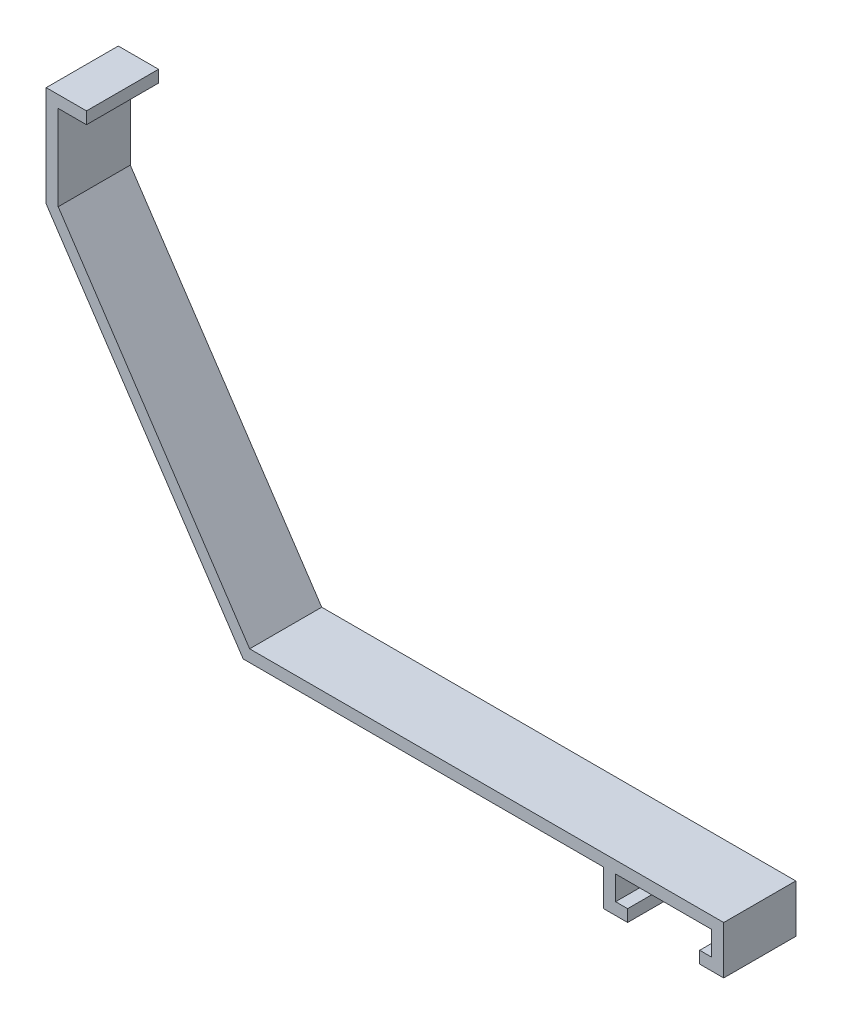
ISO-10303-21;
HEADER;
FILE_DESCRIPTION(('STEP AP214'),'2;1');
FILE_NAME('part.step','',(''),(''),'','','');
FILE_SCHEMA(('AUTOMOTIVE_DESIGN { 1 0 10303 214 1 1 1 1 }'));
ENDSEC;
DATA;
#1=APPLICATION_CONTEXT('core data for automotive mechanical design processes');
#2=APPLICATION_PROTOCOL_DEFINITION('international standard','automotive_design',2000,#1);
#3=PRODUCT_CONTEXT('',#1,'mechanical');
#4=PRODUCT('Part','Part','',(#3));
#5=PRODUCT_RELATED_PRODUCT_CATEGORY('part','',(#4));
#6=PRODUCT_DEFINITION_FORMATION('','',#4);
#7=PRODUCT_DEFINITION_CONTEXT('part definition',#1,'design');
#8=PRODUCT_DEFINITION('design','',#6,#7);
#9=PRODUCT_DEFINITION_SHAPE('','',#8);
#10=(LENGTH_UNIT() NAMED_UNIT(*) SI_UNIT(.MILLI.,.METRE.));
#11=(NAMED_UNIT(*) PLANE_ANGLE_UNIT() SI_UNIT($,.RADIAN.));
#12=(NAMED_UNIT(*) SI_UNIT($,.STERADIAN.) SOLID_ANGLE_UNIT());
#13=UNCERTAINTY_MEASURE_WITH_UNIT(LENGTH_MEASURE(1.E-05),#10,'distance_accuracy_value','');
#14=(GEOMETRIC_REPRESENTATION_CONTEXT(3) GLOBAL_UNCERTAINTY_ASSIGNED_CONTEXT((#13)) GLOBAL_UNIT_ASSIGNED_CONTEXT((#10,
#11,#12)) REPRESENTATION_CONTEXT('',''));
#15=CARTESIAN_POINT('',(0.,0.,0.));
#16=DIRECTION('',(0.,0.,1.));
#17=DIRECTION('',(1.,0.,0.));
#18=AXIS2_PLACEMENT_3D('',#15,#16,#17);
#19=CARTESIAN_POINT('',(0.,-1.5875,9.525));
#20=DIRECTION('',(-1.,0.,0.));
#21=DIRECTION('',(0.,0.,1.));
#22=AXIS2_PLACEMENT_3D('',#19,#20,#21);
#23=PLANE('',#22);
#24=DIRECTION('',(0.,1.,0.));
#25=VECTOR('',#24,1.);
#26=CARTESIAN_POINT('',(0.,-1.5875,0.));
#27=LINE('',#26,#25);
#28=CARTESIAN_POINT('',(0.,-1.5875,0.));
#29=VERTEX_POINT('',#28);
#30=CARTESIAN_POINT('',(0.,0.,0.));
#31=VERTEX_POINT('',#30);
#32=EDGE_CURVE('E201',#29,#31,#27,.T.);
#33=ORIENTED_EDGE('',*,*,#32,.T.);
#34=DIRECTION('',(0.,0.,-1.));
#35=VECTOR('',#34,1.);
#36=CARTESIAN_POINT('',(0.,0.,9.525));
#37=LINE('',#36,#35);
#38=CARTESIAN_POINT('',(0.,0.,9.525));
#39=VERTEX_POINT('',#38);
#40=EDGE_CURVE('E11',#39,#31,#37,.T.);
#41=ORIENTED_EDGE('',*,*,#40,.F.);
#42=DIRECTION('',(0.,1.,0.));
#43=VECTOR('',#42,1.);
#44=CARTESIAN_POINT('',(0.,-1.5875,9.525));
#45=LINE('',#44,#43);
#46=CARTESIAN_POINT('',(0.,-1.5875,9.525));
#47=VERTEX_POINT('',#46);
#48=EDGE_CURVE('E239',#47,#39,#45,.T.);
#49=ORIENTED_EDGE('',*,*,#48,.F.);
#50=DIRECTION('',(0.,0.,-1.));
#51=VECTOR('',#50,1.);
#52=CARTESIAN_POINT('',(0.,-1.5875,9.525));
#53=LINE('',#52,#51);
#54=EDGE_CURVE('E197',#47,#29,#53,.T.);
#55=ORIENTED_EDGE('',*,*,#54,.T.);
#56=EDGE_LOOP('',(#33,#41,#49,#55));
#57=FACE_BOUND('',#56,.T.);
#58=ADVANCED_FACE('F33',(#57),#23,.F.);
#59=CARTESIAN_POINT('',(0.,0.,9.525));
#60=DIRECTION('',(0.,-1.,0.));
#61=DIRECTION('',(1.,0.,0.));
#62=AXIS2_PLACEMENT_3D('',#59,#60,#61);
#63=PLANE('',#62);
#64=DIRECTION('',(-1.,0.,0.));
#65=VECTOR('',#64,1.);
#66=CARTESIAN_POINT('',(0.,0.,0.));
#67=LINE('',#66,#65);
#68=CARTESIAN_POINT('',(-5.3213,0.,0.));
#69=VERTEX_POINT('',#68);
#70=EDGE_CURVE('E204',#31,#69,#67,.T.);
#71=ORIENTED_EDGE('',*,*,#70,.T.);
#72=DIRECTION('',(0.,0.,-1.));
#73=VECTOR('',#72,1.);
#74=CARTESIAN_POINT('',(-5.3213,0.,9.525));
#75=LINE('',#74,#73);
#76=CARTESIAN_POINT('',(-5.3213,0.,9.525));
#77=VERTEX_POINT('',#76);
#78=EDGE_CURVE('E41',#77,#69,#75,.T.);
#79=ORIENTED_EDGE('',*,*,#78,.F.);
#80=DIRECTION('',(-1.,0.,0.));
#81=VECTOR('',#80,1.);
#82=CARTESIAN_POINT('',(0.,0.,9.525));
#83=LINE('',#82,#81);
#84=EDGE_CURVE('E128',#39,#77,#83,.T.);
#85=ORIENTED_EDGE('',*,*,#84,.F.);
#86=ORIENTED_EDGE('',*,*,#40,.T.);
#87=EDGE_LOOP('',(#71,#79,#85,#86));
#88=FACE_BOUND('',#87,.T.);
#89=ADVANCED_FACE('F357',(#88),#63,.F.);
#90=CARTESIAN_POINT('',(-5.3213,0.,9.525));
#91=DIRECTION('',(1.,0.,0.));
#92=DIRECTION('',(0.,1.,0.));
#93=AXIS2_PLACEMENT_3D('',#90,#91,#92);
#94=PLANE('',#93);
#95=DIRECTION('',(0.,-1.,0.));
#96=VECTOR('',#95,1.);
#97=CARTESIAN_POINT('',(-5.3213,0.,0.));
#98=LINE('',#97,#96);
#99=CARTESIAN_POINT('',(-5.3213,-13.3191597256673,0.));
#100=VERTEX_POINT('',#99);
#101=EDGE_CURVE('E206',#69,#100,#98,.T.);
#102=ORIENTED_EDGE('',*,*,#101,.T.);
#103=DIRECTION('',(0.,0.,-1.));
#104=VECTOR('',#103,1.);
#105=CARTESIAN_POINT('',(-5.3213,-13.3191597256673,9.525));
#106=LINE('',#105,#104);
#107=CARTESIAN_POINT('',(-5.3213,-13.3191597256673,9.525));
#108=VERTEX_POINT('',#107);
#109=EDGE_CURVE('E282',#108,#100,#106,.T.);
#110=ORIENTED_EDGE('',*,*,#109,.F.);
#111=DIRECTION('',(0.,-1.,0.));
#112=VECTOR('',#111,1.);
#113=CARTESIAN_POINT('',(-5.3213,0.,9.525));
#114=LINE('',#113,#112);
#115=EDGE_CURVE('E290',#77,#108,#114,.T.);
#116=ORIENTED_EDGE('',*,*,#115,.F.);
#117=ORIENTED_EDGE('',*,*,#78,.T.);
#118=EDGE_LOOP('',(#102,#110,#116,#117));
#119=FACE_BOUND('',#118,.T.);
#120=ADVANCED_FACE('F288',(#119),#94,.F.);
#121=CARTESIAN_POINT('',(-5.3213,-13.3191597256673,9.525));
#122=DIRECTION('',(0.832050948079559,0.554699215611404,0.));
#123=DIRECTION('',(-0.554699215611404,0.832050948079559,0.));
#124=AXIS2_PLACEMENT_3D('',#121,#122,#123);
#125=PLANE('',#124);
#126=DIRECTION('',(0.554699215611404,-0.832050948079559,0.));
#127=VECTOR('',#126,1.);
#128=CARTESIAN_POINT('',(-5.3213,-13.3191597256673,0.));
#129=LINE('',#128,#127);
#130=CARTESIAN_POINT('',(20.7152825744849,-52.3741333152252,0.));
#131=VERTEX_POINT('',#130);
#132=EDGE_CURVE('E208',#100,#131,#129,.T.);
#133=ORIENTED_EDGE('',*,*,#132,.T.);
#134=DIRECTION('',(0.,0.,-1.));
#135=VECTOR('',#134,1.);
#136=CARTESIAN_POINT('',(20.7152825744849,-52.3741333152252,9.525));
#137=LINE('',#136,#135);
#138=CARTESIAN_POINT('',(20.7152825744849,-52.3741333152252,9.525));
#139=VERTEX_POINT('',#138);
#140=EDGE_CURVE('E279',#139,#131,#137,.T.);
#141=ORIENTED_EDGE('',*,*,#140,.F.);
#142=DIRECTION('',(0.554699215611404,-0.832050948079559,0.));
#143=VECTOR('',#142,1.);
#144=CARTESIAN_POINT('',(-5.3213,-13.3191597256673,9.525));
#145=LINE('',#144,#143);
#146=EDGE_CURVE('E308',#108,#139,#145,.T.);
#147=ORIENTED_EDGE('',*,*,#146,.F.);
#148=ORIENTED_EDGE('',*,*,#109,.T.);
#149=EDGE_LOOP('',(#133,#141,#147,#148));
#150=FACE_BOUND('',#149,.T.);
#151=ADVANCED_FACE('F299',(#150),#125,.F.);
#152=CARTESIAN_POINT('',(20.7152825744849,-52.3741333152252,9.525));
#153=DIRECTION('',(0.,1.,0.));
#154=DIRECTION('',(-1.,0.,0.));
#155=AXIS2_PLACEMENT_3D('',#152,#153,#154);
#156=PLANE('',#155);
#157=DIRECTION('',(1.,0.,0.));
#158=VECTOR('',#157,1.);
#159=CARTESIAN_POINT('',(20.7152825744849,-52.3741333152252,0.));
#160=LINE('',#159,#158);
#161=CARTESIAN_POINT('',(68.3402825744848,-52.3741333152252,0.));
#162=VERTEX_POINT('',#161);
#163=EDGE_CURVE('E210',#131,#162,#160,.T.);
#164=ORIENTED_EDGE('',*,*,#163,.T.);
#165=DIRECTION('',(0.,0.,-1.));
#166=VECTOR('',#165,1.);
#167=CARTESIAN_POINT('',(68.3402825744848,-52.3741333152252,9.525));
#168=LINE('',#167,#166);
#169=CARTESIAN_POINT('',(68.3402825744848,-52.3741333152252,9.525));
#170=VERTEX_POINT('',#169);
#171=EDGE_CURVE('E276',#170,#162,#168,.T.);
#172=ORIENTED_EDGE('',*,*,#171,.F.);
#173=DIRECTION('',(1.,0.,0.));
#174=VECTOR('',#173,1.);
#175=CARTESIAN_POINT('',(20.7152825744849,-52.3741333152252,9.525));
#176=LINE('',#175,#174);
#177=EDGE_CURVE('E305',#139,#170,#176,.T.);
#178=ORIENTED_EDGE('',*,*,#177,.F.);
#179=ORIENTED_EDGE('',*,*,#140,.T.);
#180=EDGE_LOOP('',(#164,#172,#178,#179));
#181=FACE_BOUND('',#180,.T.);
#182=ADVANCED_FACE('F303',(#181),#156,.F.);
#183=CARTESIAN_POINT('',(68.3402825744848,-52.3741333152252,9.525));
#184=DIRECTION('',(1.,0.,0.));
#185=DIRECTION('',(0.,1.,0.));
#186=AXIS2_PLACEMENT_3D('',#183,#184,#185);
#187=PLANE('',#186);
#188=DIRECTION('',(0.,-1.,0.));
#189=VECTOR('',#188,1.);
#190=CARTESIAN_POINT('',(68.3402825744848,-52.3741333152252,0.));
#191=LINE('',#190,#189);
#192=CARTESIAN_POINT('',(68.3402825744849,-57.1366333152252,0.));
#193=VERTEX_POINT('',#192);
#194=EDGE_CURVE('E212',#162,#193,#191,.T.);
#195=ORIENTED_EDGE('',*,*,#194,.T.);
#196=DIRECTION('',(0.,0.,-1.));
#197=VECTOR('',#196,1.);
#198=CARTESIAN_POINT('',(68.3402825744849,-57.1366333152252,9.525));
#199=LINE('',#198,#197);
#200=CARTESIAN_POINT('',(68.3402825744849,-57.1366333152252,9.525));
#201=VERTEX_POINT('',#200);
#202=EDGE_CURVE('E273',#201,#193,#199,.T.);
#203=ORIENTED_EDGE('',*,*,#202,.F.);
#204=DIRECTION('',(0.,-1.,0.));
#205=VECTOR('',#204,1.);
#206=CARTESIAN_POINT('',(68.3402825744848,-52.3741333152252,9.525));
#207=LINE('',#206,#205);
#208=EDGE_CURVE('E307',#170,#201,#207,.T.);
#209=ORIENTED_EDGE('',*,*,#208,.F.);
#210=ORIENTED_EDGE('',*,*,#171,.T.);
#211=EDGE_LOOP('',(#195,#203,#209,#210));
#212=FACE_BOUND('',#211,.T.);
#213=ADVANCED_FACE('F370',(#212),#187,.F.);
#214=CARTESIAN_POINT('',(68.3402825744849,-57.1366333152252,9.525));
#215=DIRECTION('',(0.,1.,0.));
#216=DIRECTION('',(0.,0.,1.));
#217=AXIS2_PLACEMENT_3D('',#214,#215,#216);
#218=PLANE('',#217);
#219=DIRECTION('',(1.,0.,0.));
#220=VECTOR('',#219,1.);
#221=CARTESIAN_POINT('',(68.3402825744849,-57.1366333152252,0.));
#222=LINE('',#221,#220);
#223=CARTESIAN_POINT('',(71.5152825744849,-57.1366333152252,0.));
#224=VERTEX_POINT('',#223);
#225=EDGE_CURVE('E214',#193,#224,#222,.T.);
#226=ORIENTED_EDGE('',*,*,#225,.T.);
#227=DIRECTION('',(0.,0.,-1.));
#228=VECTOR('',#227,1.);
#229=CARTESIAN_POINT('',(71.5152825744849,-57.1366333152252,9.525));
#230=LINE('',#229,#228);
#231=CARTESIAN_POINT('',(71.5152825744849,-57.1366333152252,9.525));
#232=VERTEX_POINT('',#231);
#233=EDGE_CURVE('E270',#232,#224,#230,.T.);
#234=ORIENTED_EDGE('',*,*,#233,.F.);
#235=DIRECTION('',(1.,0.,0.));
#236=VECTOR('',#235,1.);
#237=CARTESIAN_POINT('',(68.3402825744849,-57.1366333152252,9.525));
#238=LINE('',#237,#236);
#239=EDGE_CURVE('E310',#201,#232,#238,.T.);
#240=ORIENTED_EDGE('',*,*,#239,.F.);
#241=ORIENTED_EDGE('',*,*,#202,.T.);
#242=EDGE_LOOP('',(#226,#234,#240,#241));
#243=FACE_BOUND('',#242,.T.);
#244=ADVANCED_FACE('F373',(#243),#218,.F.);
#245=CARTESIAN_POINT('',(71.5152825744849,-57.1366333152252,9.525));
#246=DIRECTION('',(-1.,0.,0.));
#247=DIRECTION('',(0.,0.,1.));
#248=AXIS2_PLACEMENT_3D('',#245,#246,#247);
#249=PLANE('',#248);
#250=DIRECTION('',(0.,1.,0.));
#251=VECTOR('',#250,1.);
#252=CARTESIAN_POINT('',(71.5152825744849,-57.1366333152252,0.));
#253=LINE('',#252,#251);
#254=CARTESIAN_POINT('',(71.5152825744849,-55.5491333152252,0.));
#255=VERTEX_POINT('',#254);
#256=EDGE_CURVE('E216',#224,#255,#253,.T.);
#257=ORIENTED_EDGE('',*,*,#256,.T.);
#258=DIRECTION('',(0.,0.,-1.));
#259=VECTOR('',#258,1.);
#260=CARTESIAN_POINT('',(71.5152825744849,-55.5491333152252,9.525));
#261=LINE('',#260,#259);
#262=CARTESIAN_POINT('',(71.5152825744849,-55.5491333152252,9.525));
#263=VERTEX_POINT('',#262);
#264=EDGE_CURVE('E267',#263,#255,#261,.T.);
#265=ORIENTED_EDGE('',*,*,#264,.F.);
#266=DIRECTION('',(0.,1.,0.));
#267=VECTOR('',#266,1.);
#268=CARTESIAN_POINT('',(71.5152825744849,-57.1366333152252,9.525));
#269=LINE('',#268,#267);
#270=EDGE_CURVE('E316',#232,#263,#269,.T.);
#271=ORIENTED_EDGE('',*,*,#270,.F.);
#272=ORIENTED_EDGE('',*,*,#233,.T.);
#273=EDGE_LOOP('',(#257,#265,#271,#272));
#274=FACE_BOUND('',#273,.T.);
#275=ADVANCED_FACE('F377',(#274),#249,.F.);
#276=CARTESIAN_POINT('',(71.5152825744849,-55.5491333152252,9.525));
#277=DIRECTION('',(0.,-1.,0.));
#278=DIRECTION('',(0.,0.,-1.));
#279=AXIS2_PLACEMENT_3D('',#276,#277,#278);
#280=PLANE('',#279);
#281=DIRECTION('',(-1.,0.,0.));
#282=VECTOR('',#281,1.);
#283=CARTESIAN_POINT('',(71.5152825744849,-55.5491333152252,0.));
#284=LINE('',#283,#282);
#285=CARTESIAN_POINT('',(69.9277825744849,-55.5491333152252,0.));
#286=VERTEX_POINT('',#285);
#287=EDGE_CURVE('E218',#255,#286,#284,.T.);
#288=ORIENTED_EDGE('',*,*,#287,.T.);
#289=DIRECTION('',(0.,0.,-1.));
#290=VECTOR('',#289,1.);
#291=CARTESIAN_POINT('',(69.9277825744849,-55.5491333152252,9.525));
#292=LINE('',#291,#290);
#293=CARTESIAN_POINT('',(69.9277825744849,-55.5491333152252,9.525));
#294=VERTEX_POINT('',#293);
#295=EDGE_CURVE('E264',#294,#286,#292,.T.);
#296=ORIENTED_EDGE('',*,*,#295,.F.);
#297=DIRECTION('',(-1.,0.,0.));
#298=VECTOR('',#297,1.);
#299=CARTESIAN_POINT('',(71.5152825744849,-55.5491333152252,9.525));
#300=LINE('',#299,#298);
#301=EDGE_CURVE('E318',#263,#294,#300,.T.);
#302=ORIENTED_EDGE('',*,*,#301,.F.);
#303=ORIENTED_EDGE('',*,*,#264,.T.);
#304=EDGE_LOOP('',(#288,#296,#302,#303));
#305=FACE_BOUND('',#304,.T.);
#306=ADVANCED_FACE('F381',(#305),#280,.F.);
#307=CARTESIAN_POINT('',(69.9277825744849,-55.5491333152252,9.525));
#308=DIRECTION('',(-1.,0.,0.));
#309=DIRECTION('',(0.,0.,1.));
#310=AXIS2_PLACEMENT_3D('',#307,#308,#309);
#311=PLANE('',#310);
#312=DIRECTION('',(0.,1.,0.));
#313=VECTOR('',#312,1.);
#314=CARTESIAN_POINT('',(69.9277825744849,-55.5491333152252,0.));
#315=LINE('',#314,#313);
#316=CARTESIAN_POINT('',(69.9277825744849,-52.3741333152252,0.));
#317=VERTEX_POINT('',#316);
#318=EDGE_CURVE('E220',#286,#317,#315,.T.);
#319=ORIENTED_EDGE('',*,*,#318,.T.);
#320=DIRECTION('',(0.,0.,-1.));
#321=VECTOR('',#320,1.);
#322=CARTESIAN_POINT('',(69.9277825744849,-52.3741333152252,9.525));
#323=LINE('',#322,#321);
#324=CARTESIAN_POINT('',(69.9277825744849,-52.3741333152252,9.525));
#325=VERTEX_POINT('',#324);
#326=EDGE_CURVE('E261',#325,#317,#323,.T.);
#327=ORIENTED_EDGE('',*,*,#326,.F.);
#328=DIRECTION('',(0.,1.,0.));
#329=VECTOR('',#328,1.);
#330=CARTESIAN_POINT('',(69.9277825744849,-55.5491333152252,9.525));
#331=LINE('',#330,#329);
#332=EDGE_CURVE('E320',#294,#325,#331,.T.);
#333=ORIENTED_EDGE('',*,*,#332,.F.);
#334=ORIENTED_EDGE('',*,*,#295,.T.);
#335=EDGE_LOOP('',(#319,#327,#333,#334));
#336=FACE_BOUND('',#335,.T.);
#337=ADVANCED_FACE('F385',(#336),#311,.F.);
#338=CARTESIAN_POINT('',(69.9277825744849,-52.3741333152252,9.525));
#339=DIRECTION('',(0.,1.,0.));
#340=DIRECTION('',(-1.,0.,0.));
#341=AXIS2_PLACEMENT_3D('',#338,#339,#340);
#342=PLANE('',#341);
#343=DIRECTION('',(1.,0.,0.));
#344=VECTOR('',#343,1.);
#345=CARTESIAN_POINT('',(69.9277825744849,-52.3741333152252,0.));
#346=LINE('',#345,#344);
#347=CARTESIAN_POINT('',(82.6277825744848,-52.3741333152252,0.));
#348=VERTEX_POINT('',#347);
#349=EDGE_CURVE('E222',#317,#348,#346,.T.);
#350=ORIENTED_EDGE('',*,*,#349,.T.);
#351=DIRECTION('',(0.,0.,-1.));
#352=VECTOR('',#351,1.);
#353=CARTESIAN_POINT('',(82.6277825744848,-52.3741333152252,9.525));
#354=LINE('',#353,#352);
#355=CARTESIAN_POINT('',(82.6277825744848,-52.3741333152252,9.525));
#356=VERTEX_POINT('',#355);
#357=EDGE_CURVE('E258',#356,#348,#354,.T.);
#358=ORIENTED_EDGE('',*,*,#357,.F.);
#359=DIRECTION('',(1.,0.,0.));
#360=VECTOR('',#359,1.);
#361=CARTESIAN_POINT('',(69.9277825744849,-52.3741333152252,9.525));
#362=LINE('',#361,#360);
#363=EDGE_CURVE('E322',#325,#356,#362,.T.);
#364=ORIENTED_EDGE('',*,*,#363,.F.);
#365=ORIENTED_EDGE('',*,*,#326,.T.);
#366=EDGE_LOOP('',(#350,#358,#364,#365));
#367=FACE_BOUND('',#366,.T.);
#368=ADVANCED_FACE('F389',(#367),#342,.F.);
#369=CARTESIAN_POINT('',(82.6277825744848,-52.3741333152252,9.525));
#370=DIRECTION('',(1.,0.,0.));
#371=DIRECTION('',(0.,1.,0.));
#372=AXIS2_PLACEMENT_3D('',#369,#370,#371);
#373=PLANE('',#372);
#374=DIRECTION('',(0.,-1.,0.));
#375=VECTOR('',#374,1.);
#376=CARTESIAN_POINT('',(82.6277825744848,-52.3741333152252,0.));
#377=LINE('',#376,#375);
#378=CARTESIAN_POINT('',(82.6277825744849,-55.5491333152252,0.));
#379=VERTEX_POINT('',#378);
#380=EDGE_CURVE('E224',#348,#379,#377,.T.);
#381=ORIENTED_EDGE('',*,*,#380,.T.);
#382=DIRECTION('',(0.,0.,-1.));
#383=VECTOR('',#382,1.);
#384=CARTESIAN_POINT('',(82.6277825744849,-55.5491333152252,9.525));
#385=LINE('',#384,#383);
#386=CARTESIAN_POINT('',(82.6277825744849,-55.5491333152252,9.525));
#387=VERTEX_POINT('',#386);
#388=EDGE_CURVE('E255',#387,#379,#385,.T.);
#389=ORIENTED_EDGE('',*,*,#388,.F.);
#390=DIRECTION('',(0.,-1.,0.));
#391=VECTOR('',#390,1.);
#392=CARTESIAN_POINT('',(82.6277825744848,-52.3741333152252,9.525));
#393=LINE('',#392,#391);
#394=EDGE_CURVE('E324',#356,#387,#393,.T.);
#395=ORIENTED_EDGE('',*,*,#394,.F.);
#396=ORIENTED_EDGE('',*,*,#357,.T.);
#397=EDGE_LOOP('',(#381,#389,#395,#396));
#398=FACE_BOUND('',#397,.T.);
#399=ADVANCED_FACE('F393',(#398),#373,.F.);
#400=CARTESIAN_POINT('',(82.6277825744849,-55.5491333152252,9.525));
#401=DIRECTION('',(0.,-1.,0.));
#402=DIRECTION('',(1.,0.,0.));
#403=AXIS2_PLACEMENT_3D('',#400,#401,#402);
#404=PLANE('',#403);
#405=DIRECTION('',(-1.,0.,0.));
#406=VECTOR('',#405,1.);
#407=CARTESIAN_POINT('',(82.6277825744849,-55.5491333152252,0.));
#408=LINE('',#407,#406);
#409=CARTESIAN_POINT('',(81.0402825744849,-55.5491333152252,0.));
#410=VERTEX_POINT('',#409);
#411=EDGE_CURVE('E226',#379,#410,#408,.T.);
#412=ORIENTED_EDGE('',*,*,#411,.T.);
#413=DIRECTION('',(0.,0.,-1.));
#414=VECTOR('',#413,1.);
#415=CARTESIAN_POINT('',(81.0402825744849,-55.5491333152252,9.525));
#416=LINE('',#415,#414);
#417=CARTESIAN_POINT('',(81.0402825744849,-55.5491333152252,9.525));
#418=VERTEX_POINT('',#417);
#419=EDGE_CURVE('E252',#418,#410,#416,.T.);
#420=ORIENTED_EDGE('',*,*,#419,.F.);
#421=DIRECTION('',(-1.,0.,0.));
#422=VECTOR('',#421,1.);
#423=CARTESIAN_POINT('',(82.6277825744849,-55.5491333152252,9.525));
#424=LINE('',#423,#422);
#425=EDGE_CURVE('E326',#387,#418,#424,.T.);
#426=ORIENTED_EDGE('',*,*,#425,.F.);
#427=ORIENTED_EDGE('',*,*,#388,.T.);
#428=EDGE_LOOP('',(#412,#420,#426,#427));
#429=FACE_BOUND('',#428,.T.);
#430=ADVANCED_FACE('F397',(#429),#404,.F.);
#431=CARTESIAN_POINT('',(81.0402825744849,-55.5491333152252,9.525));
#432=DIRECTION('',(1.,0.,0.));
#433=DIRECTION('',(0.,0.,-1.));
#434=AXIS2_PLACEMENT_3D('',#431,#432,#433);
#435=PLANE('',#434);
#436=DIRECTION('',(0.,-1.,0.));
#437=VECTOR('',#436,1.);
#438=CARTESIAN_POINT('',(81.0402825744849,-55.5491333152252,0.));
#439=LINE('',#438,#437);
#440=CARTESIAN_POINT('',(81.0402825744849,-57.1366333152252,0.));
#441=VERTEX_POINT('',#440);
#442=EDGE_CURVE('E228',#410,#441,#439,.T.);
#443=ORIENTED_EDGE('',*,*,#442,.T.);
#444=DIRECTION('',(0.,0.,-1.));
#445=VECTOR('',#444,1.);
#446=CARTESIAN_POINT('',(81.0402825744849,-57.1366333152252,9.525));
#447=LINE('',#446,#445);
#448=CARTESIAN_POINT('',(81.0402825744849,-57.1366333152252,9.525));
#449=VERTEX_POINT('',#448);
#450=EDGE_CURVE('E249',#449,#441,#447,.T.);
#451=ORIENTED_EDGE('',*,*,#450,.F.);
#452=DIRECTION('',(0.,-1.,0.));
#453=VECTOR('',#452,1.);
#454=CARTESIAN_POINT('',(81.0402825744849,-55.5491333152252,9.525));
#455=LINE('',#454,#453);
#456=EDGE_CURVE('E328',#418,#449,#455,.T.);
#457=ORIENTED_EDGE('',*,*,#456,.F.);
#458=ORIENTED_EDGE('',*,*,#419,.T.);
#459=EDGE_LOOP('',(#443,#451,#457,#458));
#460=FACE_BOUND('',#459,.T.);
#461=ADVANCED_FACE('F401',(#460),#435,.F.);
#462=CARTESIAN_POINT('',(81.0402825744849,-57.1366333152252,9.525));
#463=DIRECTION('',(0.,1.,0.));
#464=DIRECTION('',(0.,0.,1.));
#465=AXIS2_PLACEMENT_3D('',#462,#463,#464);
#466=PLANE('',#465);
#467=DIRECTION('',(1.,0.,0.));
#468=VECTOR('',#467,1.);
#469=CARTESIAN_POINT('',(81.0402825744849,-57.1366333152252,0.));
#470=LINE('',#469,#468);
#471=CARTESIAN_POINT('',(84.2152825744849,-57.1366333152252,0.));
#472=VERTEX_POINT('',#471);
#473=EDGE_CURVE('E230',#441,#472,#470,.T.);
#474=ORIENTED_EDGE('',*,*,#473,.T.);
#475=DIRECTION('',(0.,0.,-1.));
#476=VECTOR('',#475,1.);
#477=CARTESIAN_POINT('',(84.2152825744849,-57.1366333152252,9.525));
#478=LINE('',#477,#476);
#479=CARTESIAN_POINT('',(84.2152825744849,-57.1366333152252,9.525));
#480=VERTEX_POINT('',#479);
#481=EDGE_CURVE('E246',#480,#472,#478,.T.);
#482=ORIENTED_EDGE('',*,*,#481,.F.);
#483=DIRECTION('',(1.,0.,0.));
#484=VECTOR('',#483,1.);
#485=CARTESIAN_POINT('',(81.0402825744849,-57.1366333152252,9.525));
#486=LINE('',#485,#484);
#487=EDGE_CURVE('E330',#449,#480,#486,.T.);
#488=ORIENTED_EDGE('',*,*,#487,.F.);
#489=ORIENTED_EDGE('',*,*,#450,.T.);
#490=EDGE_LOOP('',(#474,#482,#488,#489));
#491=FACE_BOUND('',#490,.T.);
#492=ADVANCED_FACE('F405',(#491),#466,.F.);
#493=CARTESIAN_POINT('',(84.2152825744849,-57.1366333152252,9.525));
#494=DIRECTION('',(-1.,0.,0.));
#495=DIRECTION('',(0.,-1.,0.));
#496=AXIS2_PLACEMENT_3D('',#493,#494,#495);
#497=PLANE('',#496);
#498=DIRECTION('',(0.,1.,0.));
#499=VECTOR('',#498,1.);
#500=CARTESIAN_POINT('',(84.2152825744849,-57.1366333152252,0.));
#501=LINE('',#500,#499);
#502=CARTESIAN_POINT('',(84.2152825744848,-50.7866333152252,0.));
#503=VERTEX_POINT('',#502);
#504=EDGE_CURVE('E232',#472,#503,#501,.T.);
#505=ORIENTED_EDGE('',*,*,#504,.T.);
#506=DIRECTION('',(0.,0.,-1.));
#507=VECTOR('',#506,1.);
#508=CARTESIAN_POINT('',(84.2152825744848,-50.7866333152252,9.525));
#509=LINE('',#508,#507);
#510=CARTESIAN_POINT('',(84.2152825744848,-50.7866333152252,9.525));
#511=VERTEX_POINT('',#510);
#512=EDGE_CURVE('E243',#511,#503,#509,.T.);
#513=ORIENTED_EDGE('',*,*,#512,.F.);
#514=DIRECTION('',(0.,1.,0.));
#515=VECTOR('',#514,1.);
#516=CARTESIAN_POINT('',(84.2152825744849,-57.1366333152252,9.525));
#517=LINE('',#516,#515);
#518=EDGE_CURVE('E332',#480,#511,#517,.T.);
#519=ORIENTED_EDGE('',*,*,#518,.F.);
#520=ORIENTED_EDGE('',*,*,#481,.T.);
#521=EDGE_LOOP('',(#505,#513,#519,#520));
#522=FACE_BOUND('',#521,.T.);
#523=ADVANCED_FACE('F338',(#522),#497,.F.);
#524=CARTESIAN_POINT('',(84.2152825744848,-50.7866333152252,9.525));
#525=DIRECTION('',(0.,-1.,0.));
#526=DIRECTION('',(1.,0.,0.));
#527=AXIS2_PLACEMENT_3D('',#524,#525,#526);
#528=PLANE('',#527);
#529=DIRECTION('',(-1.,0.,0.));
#530=VECTOR('',#529,1.);
#531=CARTESIAN_POINT('',(84.2152825744848,-50.7866333152252,0.));
#532=LINE('',#531,#530);
#533=CARTESIAN_POINT('',(21.5648879944997,-50.7866333152252,0.));
#534=VERTEX_POINT('',#533);
#535=EDGE_CURVE('E234',#503,#534,#532,.T.);
#536=ORIENTED_EDGE('',*,*,#535,.T.);
#537=DIRECTION('',(0.,0.,-1.));
#538=VECTOR('',#537,1.);
#539=CARTESIAN_POINT('',(21.5648879944997,-50.7866333152252,9.525));
#540=LINE('',#539,#538);
#541=CARTESIAN_POINT('',(21.5648879944997,-50.7866333152252,9.525));
#542=VERTEX_POINT('',#541);
#543=EDGE_CURVE('E192',#542,#534,#540,.T.);
#544=ORIENTED_EDGE('',*,*,#543,.F.);
#545=DIRECTION('',(-1.,0.,0.));
#546=VECTOR('',#545,1.);
#547=CARTESIAN_POINT('',(84.2152825744848,-50.7866333152252,9.525));
#548=LINE('',#547,#546);
#549=EDGE_CURVE('E183',#511,#542,#548,.T.);
#550=ORIENTED_EDGE('',*,*,#549,.F.);
#551=ORIENTED_EDGE('',*,*,#512,.T.);
#552=EDGE_LOOP('',(#536,#544,#550,#551));
#553=FACE_BOUND('',#552,.T.);
#554=ADVANCED_FACE('F342',(#553),#528,.F.);
#555=CARTESIAN_POINT('',(21.5648879944997,-50.7866333152252,9.525));
#556=DIRECTION('',(-0.832050948079559,-0.554699215611403,0.));
#557=DIRECTION('',(0.554699215611404,-0.83205094807956,0.));
#558=AXIS2_PLACEMENT_3D('',#555,#556,#557);
#559=PLANE('',#558);
#560=DIRECTION('',(-0.554699215611404,0.832050948079559,0.));
#561=VECTOR('',#560,1.);
#562=CARTESIAN_POINT('',(21.5648879944997,-50.7866333152252,0.));
#563=LINE('',#562,#561);
#564=CARTESIAN_POINT('',(-3.7338,-12.838504422,0.));
#565=VERTEX_POINT('',#564);
#566=EDGE_CURVE('E191',#534,#565,#563,.T.);
#567=ORIENTED_EDGE('',*,*,#566,.T.);
#568=DIRECTION('',(0.,0.,-1.));
#569=VECTOR('',#568,1.);
#570=CARTESIAN_POINT('',(-3.7338,-12.838504422,9.525));
#571=LINE('',#570,#569);
#572=CARTESIAN_POINT('',(-3.7338,-12.838504422,9.525));
#573=VERTEX_POINT('',#572);
#574=EDGE_CURVE('E188',#573,#565,#571,.T.);
#575=ORIENTED_EDGE('',*,*,#574,.F.);
#576=DIRECTION('',(-0.554699215611404,0.832050948079559,0.));
#577=VECTOR('',#576,1.);
#578=CARTESIAN_POINT('',(21.5648879944997,-50.7866333152252,9.525));
#579=LINE('',#578,#577);
#580=EDGE_CURVE('E177',#542,#573,#579,.T.);
#581=ORIENTED_EDGE('',*,*,#580,.F.);
#582=ORIENTED_EDGE('',*,*,#543,.T.);
#583=EDGE_LOOP('',(#567,#575,#581,#582));
#584=FACE_BOUND('',#583,.T.);
#585=ADVANCED_FACE('F189',(#584),#559,.F.);
#586=CARTESIAN_POINT('',(-3.7338,-12.838504422,9.525));
#587=DIRECTION('',(-1.,0.,0.));
#588=DIRECTION('',(0.,0.,1.));
#589=AXIS2_PLACEMENT_3D('',#586,#587,#588);
#590=PLANE('',#589);
#591=DIRECTION('',(0.,1.,0.));
#592=VECTOR('',#591,1.);
#593=CARTESIAN_POINT('',(-3.7338,-12.838504422,0.));
#594=LINE('',#593,#592);
#595=CARTESIAN_POINT('',(-3.7338,-1.5875,0.));
#596=VERTEX_POINT('',#595);
#597=EDGE_CURVE('E114',#565,#596,#594,.T.);
#598=ORIENTED_EDGE('',*,*,#597,.T.);
#599=DIRECTION('',(0.,0.,-1.));
#600=VECTOR('',#599,1.);
#601=CARTESIAN_POINT('',(-3.7338,-1.5875,9.525));
#602=LINE('',#601,#600);
#603=CARTESIAN_POINT('',(-3.7338,-1.5875,9.525));
#604=VERTEX_POINT('',#603);
#605=EDGE_CURVE('E193',#604,#596,#602,.T.);
#606=ORIENTED_EDGE('',*,*,#605,.F.);
#607=DIRECTION('',(0.,1.,0.));
#608=VECTOR('',#607,1.);
#609=CARTESIAN_POINT('',(-3.7338,-12.838504422,9.525));
#610=LINE('',#609,#608);
#611=EDGE_CURVE('E181',#573,#604,#610,.T.);
#612=ORIENTED_EDGE('',*,*,#611,.F.);
#613=ORIENTED_EDGE('',*,*,#574,.T.);
#614=EDGE_LOOP('',(#598,#606,#612,#613));
#615=FACE_BOUND('',#614,.T.);
#616=ADVANCED_FACE('F195',(#615),#590,.F.);
#617=CARTESIAN_POINT('',(-3.7338,-1.5875,9.525));
#618=DIRECTION('',(0.,1.,0.));
#619=DIRECTION('',(0.,0.,1.));
#620=AXIS2_PLACEMENT_3D('',#617,#618,#619);
#621=PLANE('',#620);
#622=DIRECTION('',(1.,0.,0.));
#623=VECTOR('',#622,1.);
#624=CARTESIAN_POINT('',(-3.7338,-1.5875,0.));
#625=LINE('',#624,#623);
#626=EDGE_CURVE('E120',#596,#29,#625,.T.);
#627=ORIENTED_EDGE('',*,*,#626,.T.);
#628=ORIENTED_EDGE('',*,*,#54,.F.);
#629=DIRECTION('',(1.,0.,0.));
#630=VECTOR('',#629,1.);
#631=CARTESIAN_POINT('',(-3.7338,-1.5875,9.525));
#632=LINE('',#631,#630);
#633=EDGE_CURVE('E49',#604,#47,#632,.T.);
#634=ORIENTED_EDGE('',*,*,#633,.F.);
#635=ORIENTED_EDGE('',*,*,#605,.T.);
#636=EDGE_LOOP('',(#627,#628,#634,#635));
#637=FACE_BOUND('',#636,.T.);
#638=ADVANCED_FACE('F346',(#637),#621,.F.);
#639=CARTESIAN_POINT('',(0.,0.,9.525));
#640=DIRECTION('',(0.,0.,1.));
#641=DIRECTION('',(1.,0.,0.));
#642=AXIS2_PLACEMENT_3D('',#639,#640,#641);
#643=PLANE('',#642);
#644=ORIENTED_EDGE('',*,*,#48,.T.);
#645=ORIENTED_EDGE('',*,*,#84,.T.);
#646=ORIENTED_EDGE('',*,*,#115,.T.);
#647=ORIENTED_EDGE('',*,*,#146,.T.);
#648=ORIENTED_EDGE('',*,*,#177,.T.);
#649=ORIENTED_EDGE('',*,*,#208,.T.);
#650=ORIENTED_EDGE('',*,*,#239,.T.);
#651=ORIENTED_EDGE('',*,*,#270,.T.);
#652=ORIENTED_EDGE('',*,*,#301,.T.);
#653=ORIENTED_EDGE('',*,*,#332,.T.);
#654=ORIENTED_EDGE('',*,*,#363,.T.);
#655=ORIENTED_EDGE('',*,*,#394,.T.);
#656=ORIENTED_EDGE('',*,*,#425,.T.);
#657=ORIENTED_EDGE('',*,*,#456,.T.);
#658=ORIENTED_EDGE('',*,*,#487,.T.);
#659=ORIENTED_EDGE('',*,*,#518,.T.);
#660=ORIENTED_EDGE('',*,*,#549,.T.);
#661=ORIENTED_EDGE('',*,*,#580,.T.);
#662=ORIENTED_EDGE('',*,*,#611,.T.);
#663=ORIENTED_EDGE('',*,*,#633,.T.);
#664=EDGE_LOOP('',(#644,#645,#646,#647,#648,#649,#650,#651,#652,#653,#654,#655,#656,#657,#658,
#659,#660,#661,#662,#663));
#665=FACE_BOUND('',#664,.T.);
#666=ADVANCED_FACE('F179',(#665),#643,.T.);
#667=CARTESIAN_POINT('',(0.,0.,0.));
#668=DIRECTION('',(0.,0.,1.));
#669=DIRECTION('',(1.,0.,0.));
#670=AXIS2_PLACEMENT_3D('',#667,#668,#669);
#671=PLANE('',#670);
#672=ORIENTED_EDGE('',*,*,#32,.F.);
#673=ORIENTED_EDGE('',*,*,#626,.F.);
#674=ORIENTED_EDGE('',*,*,#597,.F.);
#675=ORIENTED_EDGE('',*,*,#566,.F.);
#676=ORIENTED_EDGE('',*,*,#535,.F.);
#677=ORIENTED_EDGE('',*,*,#504,.F.);
#678=ORIENTED_EDGE('',*,*,#473,.F.);
#679=ORIENTED_EDGE('',*,*,#442,.F.);
#680=ORIENTED_EDGE('',*,*,#411,.F.);
#681=ORIENTED_EDGE('',*,*,#380,.F.);
#682=ORIENTED_EDGE('',*,*,#349,.F.);
#683=ORIENTED_EDGE('',*,*,#318,.F.);
#684=ORIENTED_EDGE('',*,*,#287,.F.);
#685=ORIENTED_EDGE('',*,*,#256,.F.);
#686=ORIENTED_EDGE('',*,*,#225,.F.);
#687=ORIENTED_EDGE('',*,*,#194,.F.);
#688=ORIENTED_EDGE('',*,*,#163,.F.);
#689=ORIENTED_EDGE('',*,*,#132,.F.);
#690=ORIENTED_EDGE('',*,*,#101,.F.);
#691=ORIENTED_EDGE('',*,*,#70,.F.);
#692=EDGE_LOOP('',(#672,#673,#674,#675,#676,#677,#678,#679,#680,#681,#682,#683,#684,#685,#686,
#687,#688,#689,#690,#691));
#693=FACE_BOUND('',#692,.T.);
#694=ADVANCED_FACE('F294',(#693),#671,.F.);
#695=CLOSED_SHELL('',(#58,#89,#120,#151,#182,#213,#244,#275,#306,#337,#368,#399,#430,#461,#492,
#523,#554,#585,#616,#638,#666,#694));
#696=MANIFOLD_SOLID_BREP('B2',#695);
#697=ADVANCED_BREP_SHAPE_REPRESENTATION('',(#18,#696),#14);
#698=SHAPE_DEFINITION_REPRESENTATION(#9,#697);
ENDSEC;
END-ISO-10303-21;
